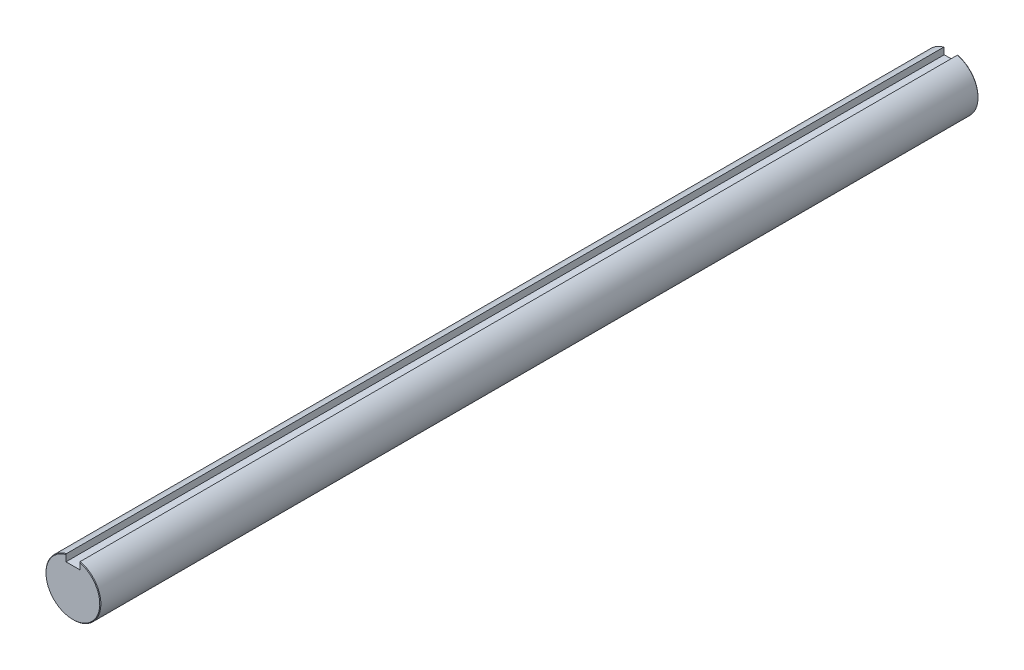
ISO-10303-21;
HEADER;
FILE_DESCRIPTION(('STEP AP214'),'2;1');
FILE_NAME('part.step','',(''),(''),'','','');
FILE_SCHEMA(('AUTOMOTIVE_DESIGN { 1 0 10303 214 1 1 1 1 }'));
ENDSEC;
DATA;
#1=APPLICATION_CONTEXT('core data for automotive mechanical design processes');
#2=APPLICATION_PROTOCOL_DEFINITION('international standard','automotive_design',2000,#1);
#3=PRODUCT_CONTEXT('',#1,'mechanical');
#4=PRODUCT('Part','Part','',(#3));
#5=PRODUCT_RELATED_PRODUCT_CATEGORY('part','',(#4));
#6=PRODUCT_DEFINITION_FORMATION('','',#4);
#7=PRODUCT_DEFINITION_CONTEXT('part definition',#1,'design');
#8=PRODUCT_DEFINITION('design','',#6,#7);
#9=PRODUCT_DEFINITION_SHAPE('','',#8);
#10=(LENGTH_UNIT() NAMED_UNIT(*) SI_UNIT(.MILLI.,.METRE.));
#11=(NAMED_UNIT(*) PLANE_ANGLE_UNIT() SI_UNIT($,.RADIAN.));
#12=(NAMED_UNIT(*) SI_UNIT($,.STERADIAN.) SOLID_ANGLE_UNIT());
#13=UNCERTAINTY_MEASURE_WITH_UNIT(LENGTH_MEASURE(1.E-05),#10,'distance_accuracy_value','');
#14=(GEOMETRIC_REPRESENTATION_CONTEXT(3) GLOBAL_UNCERTAINTY_ASSIGNED_CONTEXT((#13)) GLOBAL_UNIT_ASSIGNED_CONTEXT((#10,
#11,#12)) REPRESENTATION_CONTEXT('',''));
#15=CARTESIAN_POINT('',(0.,0.,0.));
#16=DIRECTION('',(0.,0.,1.));
#17=DIRECTION('',(1.,0.,0.));
#18=AXIS2_PLACEMENT_3D('',#15,#16,#17);
#19=CARTESIAN_POINT('',(0.,0.,76.2));
#20=DIRECTION('',(0.,0.,-1.));
#21=DIRECTION('',(-1.,0.,0.));
#22=AXIS2_PLACEMENT_3D('',#19,#20,#21);
#23=CYLINDRICAL_SURFACE('',#22,4.76249999999999);
#24=DIRECTION('',(0.,0.,-1.));
#25=VECTOR('',#24,1.);
#26=CARTESIAN_POINT('',(1.1938,4.61044984898436,76.2));
#27=LINE('',#26,#25);
#28=CARTESIAN_POINT('',(1.1938,4.61044984898436,76.1047500000001));
#29=VERTEX_POINT('',#28);
#30=CARTESIAN_POINT('',(1.1938,4.61044984898436,-76.10475));
#31=VERTEX_POINT('',#30);
#32=EDGE_CURVE('E500',#29,#31,#27,.T.);
#33=ORIENTED_EDGE('',*,*,#32,.F.);
#34=CARTESIAN_POINT('',(0.,0.,76.1047500000001));
#35=DIRECTION('',(0.,0.,1.));
#36=DIRECTION('',(1.,0.,0.));
#37=AXIS2_PLACEMENT_3D('',#34,#35,#36);
#38=CIRCLE('',#37,4.76249999999999);
#39=CARTESIAN_POINT('',(-1.1938,4.61044984898436,76.1047500000001));
#40=VERTEX_POINT('',#39);
#41=EDGE_CURVE('E620',#29,#40,#38,.F.);
#42=ORIENTED_EDGE('',*,*,#41,.T.);
#43=DIRECTION('',(0.,0.,-1.));
#44=VECTOR('',#43,1.);
#45=CARTESIAN_POINT('',(-1.1938,4.61044984898436,76.2));
#46=LINE('',#45,#44);
#47=CARTESIAN_POINT('',(-1.1938,4.61044984898436,-76.10475));
#48=VERTEX_POINT('',#47);
#49=EDGE_CURVE('E514',#40,#48,#46,.T.);
#50=ORIENTED_EDGE('',*,*,#49,.T.);
#51=CARTESIAN_POINT('',(0.,0.,-76.10475));
#52=DIRECTION('',(0.,0.,1.));
#53=DIRECTION('',(1.,0.,0.));
#54=AXIS2_PLACEMENT_3D('',#51,#52,#53);
#55=CIRCLE('',#54,4.76249999999999);
#56=EDGE_CURVE('E619',#48,#31,#55,.T.);
#57=ORIENTED_EDGE('',*,*,#56,.T.);
#58=EDGE_LOOP('',(#33,#42,#50,#57));
#59=FACE_BOUND('',#58,.T.);
#60=ADVANCED_FACE('F430',(#59),#23,.T.);
#61=CARTESIAN_POINT('',(1.1938,3.41664984898437,76.2));
#62=DIRECTION('',(1.,0.,0.));
#63=DIRECTION('',(0.,0.,-1.));
#64=AXIS2_PLACEMENT_3D('',#61,#62,#63);
#65=PLANE('',#64);
#66=DIRECTION('',(0.,-1.,0.));
#67=VECTOR('',#66,1.);
#68=CARTESIAN_POINT('',(1.1938,3.41664984898437,76.2));
#69=LINE('',#68,#67);
#70=CARTESIAN_POINT('',(1.1938,4.51199114831803,76.2));
#71=VERTEX_POINT('',#70);
#72=CARTESIAN_POINT('',(1.1938,3.41664984898437,76.2));
#73=VERTEX_POINT('',#72);
#74=EDGE_CURVE('E506',#71,#73,#69,.T.);
#75=ORIENTED_EDGE('',*,*,#74,.F.);
#76=CARTESIAN_POINT('',(1.1938,4.51199114831803,76.2));
#77=CARTESIAN_POINT('',(1.1938,4.5284064215937,76.1841306747581));
#78=CARTESIAN_POINT('',(1.1938,4.5448189499562,76.1682585121348));
#79=CARTESIAN_POINT('',(1.1938,4.57763851684497,76.1365085121348));
#80=CARTESIAN_POINT('',(1.1938,4.59404555537125,76.1206306747582));
#81=CARTESIAN_POINT('',(1.1938,4.61044984898436,76.1047500000001));
#82=B_SPLINE_CURVE_WITH_KNOTS('',3,(#76,#77,#78,#79,#80,#81),.UNSPECIFIED.,.F.,.F.,(4,2,4),(0.,
0.0684957641195765,0.136991528197788),.UNSPECIFIED.);
#83=EDGE_CURVE('E527',#71,#29,#82,.T.);
#84=ORIENTED_EDGE('',*,*,#83,.T.);
#85=ORIENTED_EDGE('',*,*,#32,.T.);
#86=CARTESIAN_POINT('',(1.1938,4.61044984898436,-76.10475));
#87=CARTESIAN_POINT('',(1.1938,4.59404555537125,-76.1206306747581));
#88=CARTESIAN_POINT('',(1.1938,4.57763851684498,-76.1365085121348));
#89=CARTESIAN_POINT('',(1.1938,4.54481894995621,-76.1682585121348));
#90=CARTESIAN_POINT('',(1.1938,4.52840642159371,-76.1841306747581));
#91=CARTESIAN_POINT('',(1.1938,4.51199114831805,-76.2));
#92=B_SPLINE_CURVE_WITH_KNOTS('',3,(#86,#87,#88,#89,#90,#91),.UNSPECIFIED.,.F.,.F.,(4,2,4),(0.,
0.06849576407821,0.136991528197787),.UNSPECIFIED.);
#93=CARTESIAN_POINT('',(1.1938,4.51199114831804,-76.2));
#94=VERTEX_POINT('',#93);
#95=EDGE_CURVE('E491',#31,#94,#92,.T.);
#96=ORIENTED_EDGE('',*,*,#95,.T.);
#97=DIRECTION('',(0.,-1.,0.));
#98=VECTOR('',#97,1.);
#99=CARTESIAN_POINT('',(1.1938,3.41664984898437,-76.2));
#100=LINE('',#99,#98);
#101=CARTESIAN_POINT('',(1.1938,3.41664984898437,-76.2));
#102=VERTEX_POINT('',#101);
#103=EDGE_CURVE('E484',#94,#102,#100,.T.);
#104=ORIENTED_EDGE('',*,*,#103,.T.);
#105=DIRECTION('',(0.,0.,-1.));
#106=VECTOR('',#105,1.);
#107=CARTESIAN_POINT('',(1.1938,3.41664984898437,76.2));
#108=LINE('',#107,#106);
#109=EDGE_CURVE('E488',#73,#102,#108,.T.);
#110=ORIENTED_EDGE('',*,*,#109,.F.);
#111=EDGE_LOOP('',(#75,#84,#85,#96,#104,#110));
#112=FACE_BOUND('',#111,.T.);
#113=ADVANCED_FACE('F487',(#112),#65,.F.);
#114=CARTESIAN_POINT('',(1.1938,3.41664984898437,76.2));
#115=DIRECTION('',(0.,-1.,0.));
#116=DIRECTION('',(1.,0.,0.));
#117=AXIS2_PLACEMENT_3D('',#114,#115,#116);
#118=PLANE('',#117);
#119=ORIENTED_EDGE('',*,*,#109,.T.);
#120=DIRECTION('',(-1.,0.,0.));
#121=VECTOR('',#120,1.);
#122=CARTESIAN_POINT('',(1.1938,3.41664984898437,-76.2));
#123=LINE('',#122,#121);
#124=CARTESIAN_POINT('',(-1.1938,3.41664984898436,-76.2));
#125=VERTEX_POINT('',#124);
#126=EDGE_CURVE('E493',#102,#125,#123,.T.);
#127=ORIENTED_EDGE('',*,*,#126,.T.);
#128=DIRECTION('',(0.,0.,-1.));
#129=VECTOR('',#128,1.);
#130=CARTESIAN_POINT('',(-1.1938,3.41664984898436,76.2));
#131=LINE('',#130,#129);
#132=CARTESIAN_POINT('',(-1.1938,3.41664984898436,76.2));
#133=VERTEX_POINT('',#132);
#134=EDGE_CURVE('E501',#133,#125,#131,.T.);
#135=ORIENTED_EDGE('',*,*,#134,.F.);
#136=DIRECTION('',(-1.,0.,0.));
#137=VECTOR('',#136,1.);
#138=CARTESIAN_POINT('',(1.1938,3.41664984898437,76.2));
#139=LINE('',#138,#137);
#140=EDGE_CURVE('E499',#73,#133,#139,.T.);
#141=ORIENTED_EDGE('',*,*,#140,.F.);
#142=EDGE_LOOP('',(#119,#127,#135,#141));
#143=FACE_BOUND('',#142,.T.);
#144=ADVANCED_FACE('F497',(#143),#118,.F.);
#145=CARTESIAN_POINT('',(-1.1938,3.41664984898436,76.2));
#146=DIRECTION('',(-1.,0.,0.));
#147=DIRECTION('',(0.,0.,1.));
#148=AXIS2_PLACEMENT_3D('',#145,#146,#147);
#149=PLANE('',#148);
#150=ORIENTED_EDGE('',*,*,#49,.F.);
#151=CARTESIAN_POINT('',(-1.1938,4.61044984898436,76.1047500000001));
#152=CARTESIAN_POINT('',(-1.1938,4.59404555537125,76.1206306747582));
#153=CARTESIAN_POINT('',(-1.1938,4.57763851684497,76.1365085121348));
#154=CARTESIAN_POINT('',(-1.1938,4.5448189499562,76.1682585121348));
#155=CARTESIAN_POINT('',(-1.1938,4.5284064215937,76.1841306747581));
#156=CARTESIAN_POINT('',(-1.1938,4.51199114831803,76.2));
#157=B_SPLINE_CURVE_WITH_KNOTS('',3,(#151,#152,#153,#154,#155,#156),.UNSPECIFIED.,.F.,.F.,(4,2,
4),(0.,0.0684957640782125,0.136991528197788),.UNSPECIFIED.);
#158=CARTESIAN_POINT('',(-1.1938,4.51199114831803,76.2));
#159=VERTEX_POINT('',#158);
#160=EDGE_CURVE('E439',#40,#159,#157,.T.);
#161=ORIENTED_EDGE('',*,*,#160,.T.);
#162=DIRECTION('',(0.,1.,0.));
#163=VECTOR('',#162,1.);
#164=CARTESIAN_POINT('',(-1.1938,3.41664984898436,76.2));
#165=LINE('',#164,#163);
#166=EDGE_CURVE('E511',#133,#159,#165,.T.);
#167=ORIENTED_EDGE('',*,*,#166,.F.);
#168=ORIENTED_EDGE('',*,*,#134,.T.);
#169=DIRECTION('',(0.,1.,0.));
#170=VECTOR('',#169,1.);
#171=CARTESIAN_POINT('',(-1.1938,3.41664984898436,-76.2));
#172=LINE('',#171,#170);
#173=CARTESIAN_POINT('',(-1.1938,4.51199114831804,-76.2));
#174=VERTEX_POINT('',#173);
#175=EDGE_CURVE('E504',#125,#174,#172,.T.);
#176=ORIENTED_EDGE('',*,*,#175,.T.);
#177=CARTESIAN_POINT('',(-1.1938,4.51199114831804,-76.2));
#178=CARTESIAN_POINT('',(-1.1938,4.5284064215937,-76.1841306747581));
#179=CARTESIAN_POINT('',(-1.1938,4.5448189499562,-76.1682585121348));
#180=CARTESIAN_POINT('',(-1.1938,4.57763851684497,-76.1365085121348));
#181=CARTESIAN_POINT('',(-1.1938,4.59404555537124,-76.1206306747581));
#182=CARTESIAN_POINT('',(-1.1938,4.61044984898436,-76.10475));
#183=B_SPLINE_CURVE_WITH_KNOTS('',3,(#177,#178,#179,#180,#181,#182),.UNSPECIFIED.,.F.,.F.,(4,2,
4),(0.,0.0684957641195787,0.136991528197788),.UNSPECIFIED.);
#184=EDGE_CURVE('E451',#174,#48,#183,.T.);
#185=ORIENTED_EDGE('',*,*,#184,.T.);
#186=EDGE_LOOP('',(#150,#161,#167,#168,#176,#185));
#187=FACE_BOUND('',#186,.T.);
#188=ADVANCED_FACE('F556',(#187),#149,.F.);
#189=CARTESIAN_POINT('',(0.,0.,76.2));
#190=DIRECTION('',(0.,0.,1.));
#191=DIRECTION('',(1.,0.,0.));
#192=AXIS2_PLACEMENT_3D('',#189,#190,#191);
#193=PLANE('',#192);
#194=ORIENTED_EDGE('',*,*,#166,.T.);
#195=CARTESIAN_POINT('',(0.,0.,76.2));
#196=DIRECTION('',(0.,0.,1.));
#197=DIRECTION('',(1.,0.,0.));
#198=AXIS2_PLACEMENT_3D('',#195,#196,#197);
#199=CIRCLE('',#198,4.66725000000003);
#200=EDGE_CURVE('E518',#159,#71,#199,.T.);
#201=ORIENTED_EDGE('',*,*,#200,.T.);
#202=ORIENTED_EDGE('',*,*,#74,.T.);
#203=ORIENTED_EDGE('',*,*,#140,.T.);
#204=EDGE_LOOP('',(#194,#201,#202,#203));
#205=FACE_BOUND('',#204,.T.);
#206=ADVANCED_FACE('F560',(#205),#193,.T.);
#207=CARTESIAN_POINT('',(0.,0.,-76.2));
#208=DIRECTION('',(0.,0.,1.));
#209=DIRECTION('',(1.,0.,0.));
#210=AXIS2_PLACEMENT_3D('',#207,#208,#209);
#211=PLANE('',#210);
#212=ORIENTED_EDGE('',*,*,#103,.F.);
#213=CARTESIAN_POINT('',(0.,0.,-76.2));
#214=DIRECTION('',(0.,0.,1.));
#215=DIRECTION('',(1.,0.,0.));
#216=AXIS2_PLACEMENT_3D('',#213,#214,#215);
#217=CIRCLE('',#216,4.66725000000004);
#218=EDGE_CURVE('E13',#94,#174,#217,.F.);
#219=ORIENTED_EDGE('',*,*,#218,.T.);
#220=ORIENTED_EDGE('',*,*,#175,.F.);
#221=ORIENTED_EDGE('',*,*,#126,.F.);
#222=EDGE_LOOP('',(#212,#219,#220,#221));
#223=FACE_BOUND('',#222,.T.);
#224=ADVANCED_FACE('F503',(#223),#211,.F.);
#225=CARTESIAN_POINT('',(0.,0.,76.2));
#226=DIRECTION('',(0.,0.,-1.));
#227=DIRECTION('',(-1.,0.,0.));
#228=AXIS2_PLACEMENT_3D('',#225,#226,#227);
#229=CONICAL_SURFACE('',#228,4.66725000000003,0.785398163397466);
#230=ORIENTED_EDGE('',*,*,#160,.F.);
#231=ORIENTED_EDGE('',*,*,#41,.F.);
#232=ORIENTED_EDGE('',*,*,#83,.F.);
#233=ORIENTED_EDGE('',*,*,#200,.F.);
#234=EDGE_LOOP('',(#230,#231,#232,#233));
#235=FACE_BOUND('',#234,.T.);
#236=ADVANCED_FACE('F541',(#235),#229,.T.);
#237=CARTESIAN_POINT('',(0.,0.,-76.10475));
#238=DIRECTION('',(0.,0.,1.));
#239=DIRECTION('',(1.,0.,0.));
#240=AXIS2_PLACEMENT_3D('',#237,#238,#239);
#241=CONICAL_SURFACE('',#240,4.76249999999999,0.785398163397321);
#242=ORIENTED_EDGE('',*,*,#184,.F.);
#243=ORIENTED_EDGE('',*,*,#218,.F.);
#244=ORIENTED_EDGE('',*,*,#95,.F.);
#245=ORIENTED_EDGE('',*,*,#56,.F.);
#246=EDGE_LOOP('',(#242,#243,#244,#245));
#247=FACE_BOUND('',#246,.T.);
#248=ADVANCED_FACE('F432',(#247),#241,.T.);
#249=CLOSED_SHELL('',(#60,#113,#144,#188,#206,#224,#236,#248));
#250=MANIFOLD_SOLID_BREP('B2',#249);
#251=ADVANCED_BREP_SHAPE_REPRESENTATION('',(#18,#250),#14);
#252=SHAPE_DEFINITION_REPRESENTATION(#9,#251);
ENDSEC;
END-ISO-10303-21;
